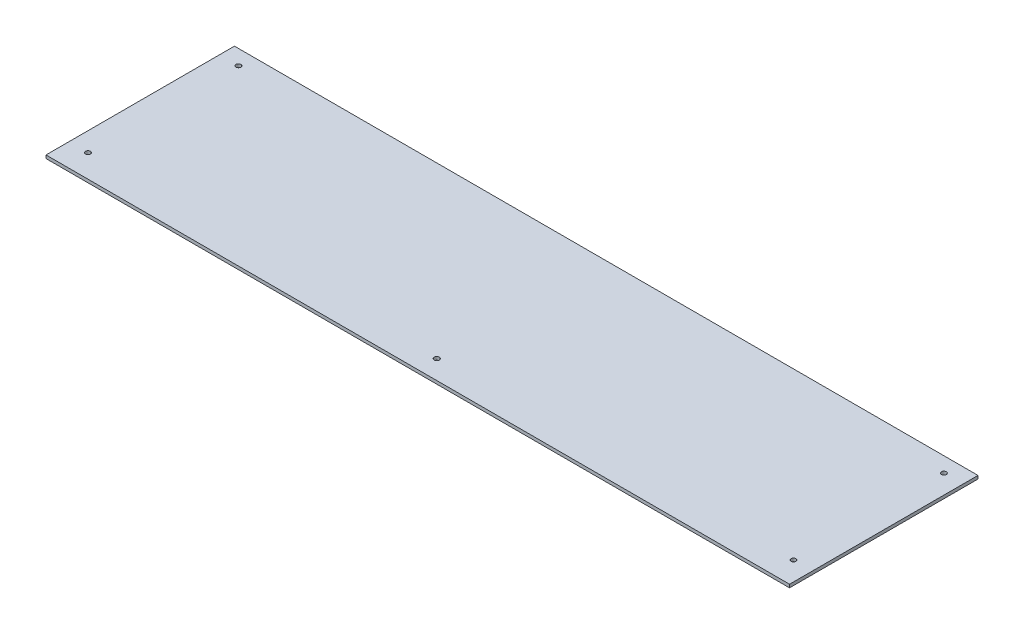
ISO-10303-21;
HEADER;
FILE_DESCRIPTION(('STEP AP214'),'2;1');
FILE_NAME('part.step','',(''),(''),'','','');
FILE_SCHEMA(('AUTOMOTIVE_DESIGN { 1 0 10303 214 1 1 1 1 }'));
ENDSEC;
DATA;
#1=APPLICATION_CONTEXT('core data for automotive mechanical design processes');
#2=APPLICATION_PROTOCOL_DEFINITION('international standard','automotive_design',2000,#1);
#3=PRODUCT_CONTEXT('',#1,'mechanical');
#4=PRODUCT('Part','Part','',(#3));
#5=PRODUCT_RELATED_PRODUCT_CATEGORY('part','',(#4));
#6=PRODUCT_DEFINITION_FORMATION('','',#4);
#7=PRODUCT_DEFINITION_CONTEXT('part definition',#1,'design');
#8=PRODUCT_DEFINITION('design','',#6,#7);
#9=PRODUCT_DEFINITION_SHAPE('','',#8);
#10=(LENGTH_UNIT() NAMED_UNIT(*) SI_UNIT(.MILLI.,.METRE.));
#11=(NAMED_UNIT(*) PLANE_ANGLE_UNIT() SI_UNIT($,.RADIAN.));
#12=(NAMED_UNIT(*) SI_UNIT($,.STERADIAN.) SOLID_ANGLE_UNIT());
#13=UNCERTAINTY_MEASURE_WITH_UNIT(LENGTH_MEASURE(1.E-05),#10,'distance_accuracy_value','');
#14=(GEOMETRIC_REPRESENTATION_CONTEXT(3) GLOBAL_UNCERTAINTY_ASSIGNED_CONTEXT((#13)) GLOBAL_UNIT_ASSIGNED_CONTEXT((#10,
#11,#12)) REPRESENTATION_CONTEXT('',''));
#15=CARTESIAN_POINT('',(0.,0.,0.));
#16=DIRECTION('',(0.,0.,1.));
#17=DIRECTION('',(1.,0.,0.));
#18=AXIS2_PLACEMENT_3D('',#15,#16,#17);
#19=CARTESIAN_POINT('',(0.,2.,0.));
#20=DIRECTION('',(0.,-1.,0.));
#21=DIRECTION('',(0.,0.,-1.));
#22=AXIS2_PLACEMENT_3D('',#19,#20,#21);
#23=PLANE('',#22);
#24=CARTESIAN_POINT('',(235.25,2.,-12.5));
#25=DIRECTION('',(0.,-1.,0.));
#26=DIRECTION('',(0.,0.,-1.));
#27=AXIS2_PLACEMENT_3D('',#24,#25,#26);
#28=CIRCLE('',#27,1.59999999999999);
#29=CARTESIAN_POINT('',(235.25,2.,-14.0999999999999));
#30=VERTEX_POINT('',#29);
#31=EDGE_CURVE('E101',#30,#30,#28,.F.);
#32=ORIENTED_EDGE('',*,*,#31,.F.);
#33=EDGE_LOOP('',(#32));
#34=FACE_BOUND('',#33,.T.);
#35=CARTESIAN_POINT('',(458.,2.,-110.));
#36=DIRECTION('',(0.,1.,0.));
#37=DIRECTION('',(0.,0.,-1.));
#38=AXIS2_PLACEMENT_3D('',#35,#36,#37);
#39=CIRCLE('',#38,1.54999999999999);
#40=CARTESIAN_POINT('',(458.,2.,-111.55));
#41=VERTEX_POINT('',#40);
#42=EDGE_CURVE('E111',#41,#41,#39,.T.);
#43=ORIENTED_EDGE('',*,*,#42,.F.);
#44=EDGE_LOOP('',(#43));
#45=FACE_BOUND('',#44,.T.);
#46=CARTESIAN_POINT('',(458.,2.,-15.));
#47=DIRECTION('',(0.,1.,0.));
#48=DIRECTION('',(0.,0.,-1.));
#49=AXIS2_PLACEMENT_3D('',#46,#47,#48);
#50=CIRCLE('',#49,1.54999999999999);
#51=CARTESIAN_POINT('',(458.,2.,-16.55));
#52=VERTEX_POINT('',#51);
#53=EDGE_CURVE('E119',#52,#52,#50,.T.);
#54=ORIENTED_EDGE('',*,*,#53,.F.);
#55=EDGE_LOOP('',(#54));
#56=FACE_BOUND('',#55,.T.);
#57=CARTESIAN_POINT('',(12.5,2.,-110.));
#58=DIRECTION('',(0.,1.,0.));
#59=DIRECTION('',(0.,0.,1.));
#60=AXIS2_PLACEMENT_3D('',#57,#58,#59);
#61=CIRCLE('',#60,1.54999999999999);
#62=CARTESIAN_POINT('',(12.5,2.,-108.45));
#63=VERTEX_POINT('',#62);
#64=EDGE_CURVE('E125',#63,#63,#61,.T.);
#65=ORIENTED_EDGE('',*,*,#64,.F.);
#66=EDGE_LOOP('',(#65));
#67=FACE_BOUND('',#66,.T.);
#68=CARTESIAN_POINT('',(12.5,2.,-15.));
#69=DIRECTION('',(0.,1.,0.));
#70=DIRECTION('',(0.,0.,1.));
#71=AXIS2_PLACEMENT_3D('',#68,#69,#70);
#72=CIRCLE('',#71,1.55);
#73=CARTESIAN_POINT('',(12.5,2.,-13.45));
#74=VERTEX_POINT('',#73);
#75=EDGE_CURVE('E11',#74,#74,#72,.T.);
#76=ORIENTED_EDGE('',*,*,#75,.F.);
#77=EDGE_LOOP('',(#76));
#78=FACE_BOUND('',#77,.T.);
#79=DIRECTION('',(1.,0.,0.));
#80=VECTOR('',#79,1.);
#81=CARTESIAN_POINT('',(470.,2.,-0.499999999999995));
#82=LINE('',#81,#80);
#83=CARTESIAN_POINT('',(0.5,2.,-0.5));
#84=VERTEX_POINT('',#83);
#85=CARTESIAN_POINT('',(470.,2.00000000000011,-0.499999999999995));
#86=VERTEX_POINT('',#85);
#87=EDGE_CURVE('E83',#84,#86,#82,.T.);
#88=ORIENTED_EDGE('',*,*,#87,.T.);
#89=DIRECTION('',(0.,0.,-1.));
#90=VECTOR('',#89,1.);
#91=CARTESIAN_POINT('',(470.,2.,-119.5));
#92=LINE('',#91,#90);
#93=CARTESIAN_POINT('',(470.,2.,-119.5));
#94=VERTEX_POINT('',#93);
#95=EDGE_CURVE('E110',#86,#94,#92,.T.);
#96=ORIENTED_EDGE('',*,*,#95,.T.);
#97=DIRECTION('',(-1.,0.,0.));
#98=VECTOR('',#97,1.);
#99=CARTESIAN_POINT('',(0.5,2.,-119.5));
#100=LINE('',#99,#98);
#101=CARTESIAN_POINT('',(0.5,2.,-119.5));
#102=VERTEX_POINT('',#101);
#103=EDGE_CURVE('E167',#94,#102,#100,.T.);
#104=ORIENTED_EDGE('',*,*,#103,.T.);
#105=DIRECTION('',(0.,0.,1.));
#106=VECTOR('',#105,1.);
#107=CARTESIAN_POINT('',(0.5,2.,-0.5));
#108=LINE('',#107,#106);
#109=EDGE_CURVE('E118',#102,#84,#108,.T.);
#110=ORIENTED_EDGE('',*,*,#109,.T.);
#111=EDGE_LOOP('',(#88,#96,#104,#110));
#112=FACE_BOUND('',#111,.T.);
#113=ADVANCED_FACE('F39',(#34,#45,#56,#67,#78,#112),#23,.F.);
#114=CARTESIAN_POINT('',(0.,0.,0.));
#115=DIRECTION('',(0.,-1.,0.));
#116=DIRECTION('',(0.,0.,-1.));
#117=AXIS2_PLACEMENT_3D('',#114,#115,#116);
#118=PLANE('',#117);
#119=CARTESIAN_POINT('',(235.25,0.,-12.5));
#120=DIRECTION('',(0.,-1.,0.));
#121=DIRECTION('',(0.,0.,-1.));
#122=AXIS2_PLACEMENT_3D('',#119,#120,#121);
#123=CIRCLE('',#122,1.59999999999999);
#124=CARTESIAN_POINT('',(235.25,0.,-14.0999999999999));
#125=VERTEX_POINT('',#124);
#126=EDGE_CURVE('E173',#125,#125,#123,.T.);
#127=ORIENTED_EDGE('',*,*,#126,.F.);
#128=EDGE_LOOP('',(#127));
#129=FACE_BOUND('',#128,.T.);
#130=CARTESIAN_POINT('',(458.,0.,-110.));
#131=DIRECTION('',(0.,1.,0.));
#132=DIRECTION('',(0.,0.,-1.));
#133=AXIS2_PLACEMENT_3D('',#130,#131,#132);
#134=CIRCLE('',#133,1.54999999999999);
#135=CARTESIAN_POINT('',(458.,0.,-111.55));
#136=VERTEX_POINT('',#135);
#137=EDGE_CURVE('E115',#136,#136,#134,.T.);
#138=ORIENTED_EDGE('',*,*,#137,.T.);
#139=EDGE_LOOP('',(#138));
#140=FACE_BOUND('',#139,.T.);
#141=CARTESIAN_POINT('',(12.5,0.,-110.));
#142=DIRECTION('',(0.,1.,0.));
#143=DIRECTION('',(0.,0.,1.));
#144=AXIS2_PLACEMENT_3D('',#141,#142,#143);
#145=CIRCLE('',#144,1.54999999999999);
#146=CARTESIAN_POINT('',(12.5,0.,-108.45));
#147=VERTEX_POINT('',#146);
#148=EDGE_CURVE('E122',#147,#147,#145,.T.);
#149=ORIENTED_EDGE('',*,*,#148,.T.);
#150=EDGE_LOOP('',(#149));
#151=FACE_BOUND('',#150,.T.);
#152=CARTESIAN_POINT('',(12.5,0.,-15.));
#153=DIRECTION('',(0.,1.,0.));
#154=DIRECTION('',(0.,0.,1.));
#155=AXIS2_PLACEMENT_3D('',#152,#153,#154);
#156=CIRCLE('',#155,1.55);
#157=CARTESIAN_POINT('',(12.5,0.,-13.45));
#158=VERTEX_POINT('',#157);
#159=EDGE_CURVE('E43',#158,#158,#156,.T.);
#160=ORIENTED_EDGE('',*,*,#159,.T.);
#161=EDGE_LOOP('',(#160));
#162=FACE_BOUND('',#161,.T.);
#163=CARTESIAN_POINT('',(458.,0.,-15.));
#164=DIRECTION('',(0.,1.,0.));
#165=DIRECTION('',(0.,0.,-1.));
#166=AXIS2_PLACEMENT_3D('',#163,#164,#165);
#167=CIRCLE('',#166,1.54999999999999);
#168=CARTESIAN_POINT('',(458.,0.,-16.55));
#169=VERTEX_POINT('',#168);
#170=EDGE_CURVE('E114',#169,#169,#167,.T.);
#171=ORIENTED_EDGE('',*,*,#170,.T.);
#172=EDGE_LOOP('',(#171));
#173=FACE_BOUND('',#172,.T.);
#174=DIRECTION('',(0.,0.,1.));
#175=VECTOR('',#174,1.);
#176=CARTESIAN_POINT('',(470.,0.,-119.5));
#177=LINE('',#176,#175);
#178=CARTESIAN_POINT('',(470.,0.,-119.5));
#179=VERTEX_POINT('',#178);
#180=CARTESIAN_POINT('',(470.,0.,-0.499999999999995));
#181=VERTEX_POINT('',#180);
#182=EDGE_CURVE('E99',#179,#181,#177,.T.);
#183=ORIENTED_EDGE('',*,*,#182,.T.);
#184=DIRECTION('',(-1.,0.,0.));
#185=VECTOR('',#184,1.);
#186=CARTESIAN_POINT('',(470.,0.,-0.499999999999995));
#187=LINE('',#186,#185);
#188=CARTESIAN_POINT('',(0.5,0.,-0.5));
#189=VERTEX_POINT('',#188);
#190=EDGE_CURVE('E62',#181,#189,#187,.T.);
#191=ORIENTED_EDGE('',*,*,#190,.T.);
#192=DIRECTION('',(0.,0.,-1.));
#193=VECTOR('',#192,1.);
#194=CARTESIAN_POINT('',(0.5,0.,-0.5));
#195=LINE('',#194,#193);
#196=CARTESIAN_POINT('',(0.5,0.,-119.5));
#197=VERTEX_POINT('',#196);
#198=EDGE_CURVE('E90',#189,#197,#195,.T.);
#199=ORIENTED_EDGE('',*,*,#198,.T.);
#200=DIRECTION('',(1.,0.,0.));
#201=VECTOR('',#200,1.);
#202=CARTESIAN_POINT('',(0.5,0.,-119.5));
#203=LINE('',#202,#201);
#204=EDGE_CURVE('E96',#197,#179,#203,.T.);
#205=ORIENTED_EDGE('',*,*,#204,.T.);
#206=EDGE_LOOP('',(#183,#191,#199,#205));
#207=FACE_BOUND('',#206,.T.);
#208=ADVANCED_FACE('F41',(#129,#140,#151,#162,#173,#207),#118,.T.);
#209=CARTESIAN_POINT('',(12.5,2.,-15.));
#210=DIRECTION('',(0.,-1.,0.));
#211=DIRECTION('',(0.,0.,-1.));
#212=AXIS2_PLACEMENT_3D('',#209,#210,#211);
#213=CYLINDRICAL_SURFACE('',#212,1.55);
#214=ORIENTED_EDGE('',*,*,#75,.T.);
#215=EDGE_LOOP('',(#214));
#216=FACE_BOUND('',#215,.T.);
#217=ORIENTED_EDGE('',*,*,#159,.F.);
#218=EDGE_LOOP('',(#217));
#219=FACE_BOUND('',#218,.T.);
#220=ADVANCED_FACE('F136',(#216,#219),#213,.F.);
#221=CARTESIAN_POINT('',(12.5,2.,-110.));
#222=DIRECTION('',(0.,-1.,0.));
#223=DIRECTION('',(0.,0.,-1.));
#224=AXIS2_PLACEMENT_3D('',#221,#222,#223);
#225=CYLINDRICAL_SURFACE('',#224,1.54999999999999);
#226=ORIENTED_EDGE('',*,*,#64,.T.);
#227=EDGE_LOOP('',(#226));
#228=FACE_BOUND('',#227,.T.);
#229=ORIENTED_EDGE('',*,*,#148,.F.);
#230=EDGE_LOOP('',(#229));
#231=FACE_BOUND('',#230,.T.);
#232=ADVANCED_FACE('F133',(#228,#231),#225,.F.);
#233=CARTESIAN_POINT('',(458.,2.,-15.));
#234=DIRECTION('',(0.,-1.,0.));
#235=DIRECTION('',(0.,0.,-1.));
#236=AXIS2_PLACEMENT_3D('',#233,#234,#235);
#237=CYLINDRICAL_SURFACE('',#236,1.54999999999999);
#238=ORIENTED_EDGE('',*,*,#53,.T.);
#239=EDGE_LOOP('',(#238));
#240=FACE_BOUND('',#239,.T.);
#241=ORIENTED_EDGE('',*,*,#170,.F.);
#242=EDGE_LOOP('',(#241));
#243=FACE_BOUND('',#242,.T.);
#244=ADVANCED_FACE('F135',(#240,#243),#237,.F.);
#245=CARTESIAN_POINT('',(458.,2.,-110.));
#246=DIRECTION('',(0.,-1.,0.));
#247=DIRECTION('',(0.,0.,-1.));
#248=AXIS2_PLACEMENT_3D('',#245,#246,#247);
#249=CYLINDRICAL_SURFACE('',#248,1.54999999999999);
#250=ORIENTED_EDGE('',*,*,#42,.T.);
#251=EDGE_LOOP('',(#250));
#252=FACE_BOUND('',#251,.T.);
#253=ORIENTED_EDGE('',*,*,#137,.F.);
#254=EDGE_LOOP('',(#253));
#255=FACE_BOUND('',#254,.T.);
#256=ADVANCED_FACE('F143',(#252,#255),#249,.F.);
#257=CARTESIAN_POINT('',(470.,487.561788035261,-0.499999999999995));
#258=DIRECTION('',(0.,0.,1.));
#259=DIRECTION('',(1.,0.,0.));
#260=AXIS2_PLACEMENT_3D('',#257,#258,#259);
#261=PLANE('',#260);
#262=DIRECTION('',(0.,-1.,0.));
#263=VECTOR('',#262,1.);
#264=CARTESIAN_POINT('',(0.5,487.561788035261,-0.5));
#265=LINE('',#264,#263);
#266=EDGE_CURVE('E79',#84,#189,#265,.T.);
#267=ORIENTED_EDGE('',*,*,#266,.T.);
#268=ORIENTED_EDGE('',*,*,#190,.F.);
#269=DIRECTION('',(0.,-1.,0.));
#270=VECTOR('',#269,1.);
#271=CARTESIAN_POINT('',(470.,487.561788035261,-0.499999999999995));
#272=LINE('',#271,#270);
#273=EDGE_CURVE('E87',#86,#181,#272,.T.);
#274=ORIENTED_EDGE('',*,*,#273,.F.);
#275=ORIENTED_EDGE('',*,*,#87,.F.);
#276=EDGE_LOOP('',(#267,#268,#274,#275));
#277=FACE_BOUND('',#276,.T.);
#278=ADVANCED_FACE('F81',(#277),#261,.T.);
#279=CARTESIAN_POINT('',(0.5,487.561788035261,-0.5));
#280=DIRECTION('',(-1.,0.,0.));
#281=DIRECTION('',(0.,0.,1.));
#282=AXIS2_PLACEMENT_3D('',#279,#280,#281);
#283=PLANE('',#282);
#284=DIRECTION('',(0.,-1.,0.));
#285=VECTOR('',#284,1.);
#286=CARTESIAN_POINT('',(0.5,487.561788035261,-119.5));
#287=LINE('',#286,#285);
#288=EDGE_CURVE('E86',#102,#197,#287,.T.);
#289=ORIENTED_EDGE('',*,*,#288,.T.);
#290=ORIENTED_EDGE('',*,*,#198,.F.);
#291=ORIENTED_EDGE('',*,*,#266,.F.);
#292=ORIENTED_EDGE('',*,*,#109,.F.);
#293=EDGE_LOOP('',(#289,#290,#291,#292));
#294=FACE_BOUND('',#293,.T.);
#295=ADVANCED_FACE('F91',(#294),#283,.T.);
#296=CARTESIAN_POINT('',(0.5,487.561788035261,-119.5));
#297=DIRECTION('',(0.,0.,-1.));
#298=DIRECTION('',(-1.,0.,0.));
#299=AXIS2_PLACEMENT_3D('',#296,#297,#298);
#300=PLANE('',#299);
#301=DIRECTION('',(0.,-1.,0.));
#302=VECTOR('',#301,1.);
#303=CARTESIAN_POINT('',(470.,487.561788035261,-119.5));
#304=LINE('',#303,#302);
#305=EDGE_CURVE('E54',#94,#179,#304,.T.);
#306=ORIENTED_EDGE('',*,*,#305,.T.);
#307=ORIENTED_EDGE('',*,*,#204,.F.);
#308=ORIENTED_EDGE('',*,*,#288,.F.);
#309=ORIENTED_EDGE('',*,*,#103,.F.);
#310=EDGE_LOOP('',(#306,#307,#308,#309));
#311=FACE_BOUND('',#310,.T.);
#312=ADVANCED_FACE('F192',(#311),#300,.T.);
#313=CARTESIAN_POINT('',(470.,487.561788035261,-119.5));
#314=DIRECTION('',(1.,0.,0.));
#315=DIRECTION('',(0.,0.,-1.));
#316=AXIS2_PLACEMENT_3D('',#313,#314,#315);
#317=PLANE('',#316);
#318=ORIENTED_EDGE('',*,*,#273,.T.);
#319=ORIENTED_EDGE('',*,*,#182,.F.);
#320=ORIENTED_EDGE('',*,*,#305,.F.);
#321=ORIENTED_EDGE('',*,*,#95,.F.);
#322=EDGE_LOOP('',(#318,#319,#320,#321));
#323=FACE_BOUND('',#322,.T.);
#324=ADVANCED_FACE('F190',(#323),#317,.T.);
#325=CARTESIAN_POINT('',(235.25,6.52548339959388,-12.5));
#326=DIRECTION('',(0.,-1.,0.));
#327=DIRECTION('',(0.,0.,-1.));
#328=AXIS2_PLACEMENT_3D('',#325,#326,#327);
#329=CYLINDRICAL_SURFACE('',#328,1.59999999999999);
#330=CARTESIAN_POINT('',(235.25,2.,-14.0999999999999));
#331=CARTESIAN_POINT('',(235.25,1.97916666666667,-14.0999999999999));
#332=CARTESIAN_POINT('',(235.25,1.95833333333333,-14.0999999999999));
#333=CARTESIAN_POINT('',(235.25,1.91666666666667,-14.0999999999999));
#334=CARTESIAN_POINT('',(235.25,1.89583333333333,-14.0999999999999));
#335=CARTESIAN_POINT('',(235.25,1.85416666666667,-14.0999999999999));
#336=CARTESIAN_POINT('',(235.25,1.83333333333333,-14.0999999999999));
#337=CARTESIAN_POINT('',(235.25,1.79166666666667,-14.0999999999999));
#338=CARTESIAN_POINT('',(235.25,1.77083333333333,-14.0999999999999));
#339=CARTESIAN_POINT('',(235.25,1.72916666666667,-14.0999999999999));
#340=CARTESIAN_POINT('',(235.25,1.70833333333333,-14.0999999999999));
#341=CARTESIAN_POINT('',(235.25,1.66666666666667,-14.0999999999999));
#342=CARTESIAN_POINT('',(235.25,1.64583333333333,-14.0999999999999));
#343=CARTESIAN_POINT('',(235.25,1.60416666666667,-14.0999999999999));
#344=CARTESIAN_POINT('',(235.25,1.58333333333333,-14.0999999999999));
#345=CARTESIAN_POINT('',(235.25,1.54166666666667,-14.0999999999999));
#346=CARTESIAN_POINT('',(235.25,1.52083333333333,-14.0999999999999));
#347=CARTESIAN_POINT('',(235.25,1.47916666666667,-14.0999999999999));
#348=CARTESIAN_POINT('',(235.25,1.45833333333333,-14.0999999999999));
#349=CARTESIAN_POINT('',(235.25,1.41666666666667,-14.0999999999999));
#350=CARTESIAN_POINT('',(235.25,1.39583333333333,-14.0999999999999));
#351=CARTESIAN_POINT('',(235.25,1.35416666666667,-14.0999999999999));
#352=CARTESIAN_POINT('',(235.25,1.33333333333333,-14.0999999999999));
#353=CARTESIAN_POINT('',(235.25,1.29166666666667,-14.0999999999999));
#354=CARTESIAN_POINT('',(235.25,1.27083333333333,-14.0999999999999));
#355=CARTESIAN_POINT('',(235.25,1.22916666666667,-14.0999999999999));
#356=CARTESIAN_POINT('',(235.25,1.20833333333333,-14.0999999999999));
#357=CARTESIAN_POINT('',(235.25,1.16666666666667,-14.0999999999999));
#358=CARTESIAN_POINT('',(235.25,1.14583333333333,-14.0999999999999));
#359=CARTESIAN_POINT('',(235.25,1.10416666666667,-14.0999999999999));
#360=CARTESIAN_POINT('',(235.25,1.08333333333333,-14.0999999999999));
#361=CARTESIAN_POINT('',(235.25,1.04166666666667,-14.0999999999999));
#362=CARTESIAN_POINT('',(235.25,1.02083333333333,-14.0999999999999));
#363=CARTESIAN_POINT('',(235.25,0.979166666666668,-14.0999999999999));
#364=CARTESIAN_POINT('',(235.25,0.958333333333334,-14.0999999999999));
#365=CARTESIAN_POINT('',(235.25,0.916666666666668,-14.0999999999999));
#366=CARTESIAN_POINT('',(235.25,0.895833333333334,-14.0999999999999));
#367=CARTESIAN_POINT('',(235.25,0.854166666666667,-14.0999999999999));
#368=CARTESIAN_POINT('',(235.25,0.833333333333334,-14.0999999999999));
#369=CARTESIAN_POINT('',(235.25,0.791666666666667,-14.0999999999999));
#370=CARTESIAN_POINT('',(235.25,0.770833333333334,-14.0999999999999));
#371=CARTESIAN_POINT('',(235.25,0.729166666666667,-14.0999999999999));
#372=CARTESIAN_POINT('',(235.25,0.708333333333334,-14.0999999999999));
#373=CARTESIAN_POINT('',(235.25,0.666666666666668,-14.0999999999999));
#374=CARTESIAN_POINT('',(235.25,0.645833333333334,-14.0999999999999));
#375=CARTESIAN_POINT('',(235.25,0.604166666666668,-14.0999999999999));
#376=CARTESIAN_POINT('',(235.25,0.583333333333335,-14.0999999999999));
#377=CARTESIAN_POINT('',(235.25,0.541666666666668,-14.0999999999999));
#378=CARTESIAN_POINT('',(235.25,0.520833333333335,-14.0999999999999));
#379=CARTESIAN_POINT('',(235.25,0.479166666666668,-14.0999999999999));
#380=CARTESIAN_POINT('',(235.25,0.458333333333335,-14.0999999999999));
#381=CARTESIAN_POINT('',(235.25,0.416666666666668,-14.0999999999999));
#382=CARTESIAN_POINT('',(235.25,0.395833333333335,-14.0999999999999));
#383=CARTESIAN_POINT('',(235.25,0.354166666666668,-14.0999999999999));
#384=CARTESIAN_POINT('',(235.25,0.333333333333335,-14.0999999999999));
#385=CARTESIAN_POINT('',(235.25,0.291666666666668,-14.0999999999999));
#386=CARTESIAN_POINT('',(235.25,0.270833333333334,-14.0999999999999));
#387=CARTESIAN_POINT('',(235.25,0.229166666666668,-14.0999999999999));
#388=CARTESIAN_POINT('',(235.25,0.208333333333334,-14.0999999999999));
#389=CARTESIAN_POINT('',(235.25,0.166666666666668,-14.0999999999999));
#390=CARTESIAN_POINT('',(235.25,0.145833333333334,-14.0999999999999));
#391=CARTESIAN_POINT('',(235.25,0.104166666666668,-14.0999999999999));
#392=CARTESIAN_POINT('',(235.25,0.0833333333333343,-14.0999999999999));
#393=CARTESIAN_POINT('',(235.25,0.0416666666666676,-14.0999999999999));
#394=CARTESIAN_POINT('',(235.25,0.0208333333333342,-14.0999999999999));
#395=CARTESIAN_POINT('',(235.25,0.,-14.0999999999999));
#396=B_SPLINE_CURVE_WITH_KNOTS('',3,(#330,#331,#332,#333,#334,#335,#336,#337,#338,#339,#340,
#341,#342,#343,#344,#345,#346,#347,#348,#349,#350,#351,#352,#353,#354,#355,#356,#357,#358,#359,
#360,#361,#362,#363,#364,#365,#366,#367,#368,#369,#370,#371,#372,#373,#374,#375,#376,#377,#378,
#379,#380,#381,#382,#383,#384,#385,#386,#387,#388,#389,#390,#391,#392,#393,#394,#395),
.UNSPECIFIED.,.F.,.F.,(4,2,2,2,2,2,2,2,2,2,2,2,2,2,2,2,2,2,2,2,2,2,2,2,2,2,2,2,2,2,2,2,4),(0.,
0.0625000000000001,0.125,0.1875,0.25,0.3125,0.375,0.4375,0.5,0.5625,0.625,0.6875,0.75,0.8125,
0.875,0.9375,1.,1.0625,1.125,1.1875,1.25,1.3125,1.375,1.4375,1.5,1.5625,1.625,1.6875,1.75,
1.8125,1.875,1.9375,2.),.UNSPECIFIED.);
#397=EDGE_CURVE('BSEAM178',#30,#125,#396,.T.);
#398=ORIENTED_EDGE('',*,*,#31,.T.);
#399=ORIENTED_EDGE('',*,*,#126,.T.);
#400=ORIENTED_EDGE('',*,*,#397,.T.);
#401=ORIENTED_EDGE('',*,*,#397,.F.);
#402=EDGE_LOOP('',(#398,#400,#399,#401));
#403=FACE_BOUND('',#402,.T.);
#404=ADVANCED_FACE('F178',(#403),#329,.F.);
#405=CLOSED_SHELL('',(#113,#208,#220,#232,#244,#256,#278,#295,#312,#324,#404));
#406=MANIFOLD_SOLID_BREP('B2',#405);
#407=ADVANCED_BREP_SHAPE_REPRESENTATION('',(#18,#406),#14);
#408=SHAPE_DEFINITION_REPRESENTATION(#9,#407);
ENDSEC;
END-ISO-10303-21;
